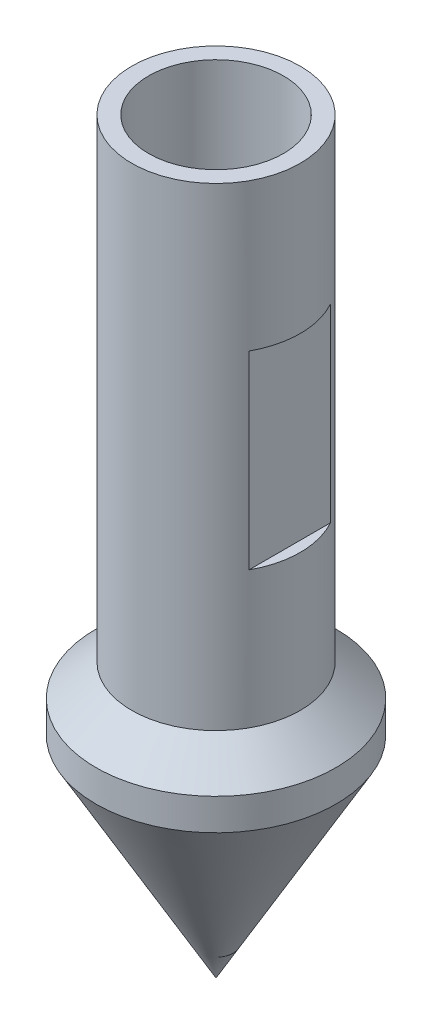
ISO-10303-21;
HEADER;
FILE_DESCRIPTION(('STEP AP214'),'2;1');
FILE_NAME('part.step','',(''),(''),'','','');
FILE_SCHEMA(('AUTOMOTIVE_DESIGN { 1 0 10303 214 1 1 1 1 }'));
ENDSEC;
DATA;
#1=APPLICATION_CONTEXT('core data for automotive mechanical design processes');
#2=APPLICATION_PROTOCOL_DEFINITION('international standard','automotive_design',2000,#1);
#3=PRODUCT_CONTEXT('',#1,'mechanical');
#4=PRODUCT('Part','Part','',(#3));
#5=PRODUCT_RELATED_PRODUCT_CATEGORY('part','',(#4));
#6=PRODUCT_DEFINITION_FORMATION('','',#4);
#7=PRODUCT_DEFINITION_CONTEXT('part definition',#1,'design');
#8=PRODUCT_DEFINITION('design','',#6,#7);
#9=PRODUCT_DEFINITION_SHAPE('','',#8);
#10=(LENGTH_UNIT() NAMED_UNIT(*) SI_UNIT(.MILLI.,.METRE.));
#11=(NAMED_UNIT(*) PLANE_ANGLE_UNIT() SI_UNIT($,.RADIAN.));
#12=(NAMED_UNIT(*) SI_UNIT($,.STERADIAN.) SOLID_ANGLE_UNIT());
#13=UNCERTAINTY_MEASURE_WITH_UNIT(LENGTH_MEASURE(1.E-05),#10,'distance_accuracy_value','');
#14=(GEOMETRIC_REPRESENTATION_CONTEXT(3) GLOBAL_UNCERTAINTY_ASSIGNED_CONTEXT((#13)) GLOBAL_UNIT_ASSIGNED_CONTEXT((#10,
#11,#12)) REPRESENTATION_CONTEXT('',''));
#15=CARTESIAN_POINT('',(0.,0.,0.));
#16=DIRECTION('',(0.,0.,1.));
#17=DIRECTION('',(1.,0.,0.));
#18=AXIS2_PLACEMENT_3D('',#15,#16,#17);
#19=CARTESIAN_POINT('',(0.,-7.60714285714286,0.));
#20=DIRECTION('',(0.,-1.,0.));
#21=DIRECTION('',(0.,0.,-1.));
#22=AXIS2_PLACEMENT_3D('',#19,#20,#21);
#23=CYLINDRICAL_SURFACE('',#22,4.);
#24=CARTESIAN_POINT('',(0.,8.5,0.));
#25=DIRECTION('',(0.,-1.,0.));
#26=DIRECTION('',(0.,0.,-1.));
#27=AXIS2_PLACEMENT_3D('',#24,#25,#26);
#28=CIRCLE('',#27,4.);
#29=CARTESIAN_POINT('',(3.5,8.5,-1.9364916731037));
#30=VERTEX_POINT('',#29);
#31=CARTESIAN_POINT('',(3.5,8.5,1.9364916731037));
#32=VERTEX_POINT('',#31);
#33=EDGE_CURVE('E104',#30,#32,#28,.T.);
#34=ORIENTED_EDGE('',*,*,#33,.F.);
#35=DIRECTION('',(0.,-1.,0.));
#36=VECTOR('',#35,1.);
#37=CARTESIAN_POINT('',(3.5,-7.60714285714286,-1.9364916731037));
#38=LINE('',#37,#36);
#39=CARTESIAN_POINT('',(3.5,-0.500000000000003,-1.9364916731037));
#40=VERTEX_POINT('',#39);
#41=EDGE_CURVE('E91',#40,#30,#38,.F.);
#42=ORIENTED_EDGE('',*,*,#41,.F.);
#43=CARTESIAN_POINT('',(0.,-0.500000000000003,0.));
#44=DIRECTION('',(0.,1.,0.));
#45=DIRECTION('',(-1.,0.,0.));
#46=AXIS2_PLACEMENT_3D('',#43,#44,#45);
#47=CIRCLE('',#46,4.);
#48=CARTESIAN_POINT('',(3.5,-0.500000000000003,1.9364916731037));
#49=VERTEX_POINT('',#48);
#50=EDGE_CURVE('E85',#49,#40,#47,.T.);
#51=ORIENTED_EDGE('',*,*,#50,.F.);
#52=DIRECTION('',(0.,-1.,0.));
#53=VECTOR('',#52,1.);
#54=CARTESIAN_POINT('',(3.5,-7.60714285714286,1.9364916731037));
#55=LINE('',#54,#53);
#56=EDGE_CURVE('E98',#32,#49,#55,.T.);
#57=ORIENTED_EDGE('',*,*,#56,.F.);
#58=EDGE_LOOP('',(#34,#42,#51,#57));
#59=FACE_BOUND('',#58,.T.);
#60=CARTESIAN_POINT('',(0.,-7.,0.));
#61=DIRECTION('',(0.,-1.,0.));
#62=DIRECTION('',(0.,0.,-1.));
#63=AXIS2_PLACEMENT_3D('',#60,#61,#62);
#64=CIRCLE('',#63,4.);
#65=CARTESIAN_POINT('',(0.,-7.,-4.));
#66=VERTEX_POINT('',#65);
#67=EDGE_CURVE('E165',#66,#66,#64,.T.);
#68=ORIENTED_EDGE('',*,*,#67,.F.);
#69=EDGE_LOOP('',(#68));
#70=FACE_BOUND('',#69,.T.);
#71=CARTESIAN_POINT('',(0.,15.5,0.));
#72=DIRECTION('',(0.,-1.,0.));
#73=DIRECTION('',(0.,0.,-1.));
#74=AXIS2_PLACEMENT_3D('',#71,#72,#73);
#75=CIRCLE('',#74,4.);
#76=CARTESIAN_POINT('',(0.,15.5,-4.));
#77=VERTEX_POINT('',#76);
#78=EDGE_CURVE('E92',#77,#77,#75,.T.);
#79=ORIENTED_EDGE('',*,*,#78,.T.);
#80=EDGE_LOOP('',(#79));
#81=FACE_BOUND('',#80,.T.);
#82=CARTESIAN_POINT('',(0.,-0.500000000000002,0.));
#83=DIRECTION('',(0.,1.,0.));
#84=DIRECTION('',(0.,0.,1.));
#85=AXIS2_PLACEMENT_3D('',#82,#83,#84);
#86=CIRCLE('',#85,4.);
#87=CARTESIAN_POINT('',(-3.5,-0.500000000000002,-1.93649167310371));
#88=VERTEX_POINT('',#87);
#89=CARTESIAN_POINT('',(-3.5,-0.500000000000002,1.93649167310371));
#90=VERTEX_POINT('',#89);
#91=EDGE_CURVE('E11',#88,#90,#86,.T.);
#92=ORIENTED_EDGE('',*,*,#91,.F.);
#93=DIRECTION('',(0.,-1.,0.));
#94=VECTOR('',#93,1.);
#95=CARTESIAN_POINT('',(-3.5,-7.60714285714286,-1.93649167310371));
#96=LINE('',#95,#94);
#97=CARTESIAN_POINT('',(-3.5,8.5,-1.9364916731037));
#98=VERTEX_POINT('',#97);
#99=EDGE_CURVE('E52',#98,#88,#96,.T.);
#100=ORIENTED_EDGE('',*,*,#99,.F.);
#101=CARTESIAN_POINT('',(0.,8.5,0.));
#102=DIRECTION('',(0.,-1.,0.));
#103=DIRECTION('',(0.,0.,-1.));
#104=AXIS2_PLACEMENT_3D('',#101,#102,#103);
#105=CIRCLE('',#104,4.);
#106=CARTESIAN_POINT('',(-3.5,8.5,1.9364916731037));
#107=VERTEX_POINT('',#106);
#108=EDGE_CURVE('E113',#107,#98,#105,.T.);
#109=ORIENTED_EDGE('',*,*,#108,.F.);
#110=DIRECTION('',(0.,-1.,0.));
#111=VECTOR('',#110,1.);
#112=CARTESIAN_POINT('',(-3.5,-7.60714285714286,1.93649167310371));
#113=LINE('',#112,#111);
#114=EDGE_CURVE('E116',#90,#107,#113,.F.);
#115=ORIENTED_EDGE('',*,*,#114,.F.);
#116=EDGE_LOOP('',(#92,#100,#109,#115));
#117=FACE_BOUND('',#116,.T.);
#118=ADVANCED_FACE('F43',(#59,#70,#81,#117),#23,.T.);
#119=CARTESIAN_POINT('',(0.,-10.,0.));
#120=DIRECTION('',(0.,1.,0.));
#121=DIRECTION('',(0.,0.,1.));
#122=AXIS2_PLACEMENT_3D('',#119,#120,#121);
#123=CONICAL_SURFACE('',#122,5.7,0.518068528456721);
#124=CARTESIAN_POINT('',(0.,-20.,0.));
#125=VERTEX_POINT('',#124);
#126=VERTEX_LOOP('',#125);
#127=FACE_BOUND('',#126,.T.);
#128=CARTESIAN_POINT('',(0.,-10.,0.));
#129=DIRECTION('',(0.,-1.,0.));
#130=DIRECTION('',(0.,0.,-1.));
#131=AXIS2_PLACEMENT_3D('',#128,#129,#130);
#132=CIRCLE('',#131,5.7);
#133=CARTESIAN_POINT('',(0.,-10.,-5.7));
#134=VERTEX_POINT('',#133);
#135=EDGE_CURVE('E174',#134,#134,#132,.T.);
#136=ORIENTED_EDGE('',*,*,#135,.T.);
#137=EDGE_LOOP('',(#136));
#138=FACE_BOUND('',#137,.T.);
#139=ADVANCED_FACE('F45',(#127,#138),#123,.T.);
#140=CARTESIAN_POINT('',(0.,15.5,0.));
#141=DIRECTION('',(0.,-1.,0.));
#142=DIRECTION('',(0.,0.,-1.));
#143=AXIS2_PLACEMENT_3D('',#140,#141,#142);
#144=PLANE('',#143);
#145=CARTESIAN_POINT('',(0.,15.5,0.));
#146=DIRECTION('',(0.,1.,0.));
#147=DIRECTION('',(0.,0.,1.));
#148=AXIS2_PLACEMENT_3D('',#145,#146,#147);
#149=CIRCLE('',#148,3.2);
#150=CARTESIAN_POINT('',(0.,15.5,3.2));
#151=VERTEX_POINT('',#150);
#152=EDGE_CURVE('E132',#151,#151,#149,.T.);
#153=ORIENTED_EDGE('',*,*,#152,.F.);
#154=EDGE_LOOP('',(#153));
#155=FACE_BOUND('',#154,.T.);
#156=ORIENTED_EDGE('',*,*,#78,.F.);
#157=EDGE_LOOP('',(#156));
#158=FACE_BOUND('',#157,.T.);
#159=ADVANCED_FACE('F146',(#155,#158),#144,.F.);
#160=CARTESIAN_POINT('',(0.,-7.,0.));
#161=DIRECTION('',(0.,-1.,0.));
#162=DIRECTION('',(0.,0.,-1.));
#163=AXIS2_PLACEMENT_3D('',#160,#161,#162);
#164=CONICAL_SURFACE('',#163,4.,0.847816973393407);
#165=CARTESIAN_POINT('',(0.,-8.5,0.));
#166=DIRECTION('',(0.,-1.,0.));
#167=DIRECTION('',(0.,0.,-1.));
#168=AXIS2_PLACEMENT_3D('',#165,#166,#167);
#169=CIRCLE('',#168,5.7);
#170=CARTESIAN_POINT('',(0.,-8.5,-5.7));
#171=VERTEX_POINT('',#170);
#172=EDGE_CURVE('E168',#171,#171,#169,.T.);
#173=ORIENTED_EDGE('',*,*,#172,.F.);
#174=EDGE_LOOP('',(#173));
#175=FACE_BOUND('',#174,.T.);
#176=ORIENTED_EDGE('',*,*,#67,.T.);
#177=EDGE_LOOP('',(#176));
#178=FACE_BOUND('',#177,.T.);
#179=ADVANCED_FACE('F149',(#175,#178),#164,.T.);
#180=CARTESIAN_POINT('',(0.,-7.60714285714286,0.));
#181=DIRECTION('',(0.,-1.,0.));
#182=DIRECTION('',(0.,0.,-1.));
#183=AXIS2_PLACEMENT_3D('',#180,#181,#182);
#184=CYLINDRICAL_SURFACE('',#183,5.7);
#185=ORIENTED_EDGE('',*,*,#135,.F.);
#186=EDGE_LOOP('',(#185));
#187=FACE_BOUND('',#186,.T.);
#188=ORIENTED_EDGE('',*,*,#172,.T.);
#189=EDGE_LOOP('',(#188));
#190=FACE_BOUND('',#189,.T.);
#191=ADVANCED_FACE('F156',(#187,#190),#184,.T.);
#192=CARTESIAN_POINT('',(0.,6.,0.));
#193=DIRECTION('',(0.,1.,0.));
#194=DIRECTION('',(0.,0.,1.));
#195=AXIS2_PLACEMENT_3D('',#192,#193,#194);
#196=CYLINDRICAL_SURFACE('',#195,3.2);
#197=CARTESIAN_POINT('',(0.,6.,0.));
#198=DIRECTION('',(0.,1.,0.));
#199=DIRECTION('',(0.,0.,1.));
#200=AXIS2_PLACEMENT_3D('',#197,#198,#199);
#201=CIRCLE('',#200,3.2);
#202=CARTESIAN_POINT('',(0.,6.,3.2));
#203=VERTEX_POINT('',#202);
#204=EDGE_CURVE('E178',#203,#203,#201,.T.);
#205=ORIENTED_EDGE('',*,*,#204,.F.);
#206=EDGE_LOOP('',(#205));
#207=FACE_BOUND('',#206,.T.);
#208=ORIENTED_EDGE('',*,*,#152,.T.);
#209=EDGE_LOOP('',(#208));
#210=FACE_BOUND('',#209,.T.);
#211=ADVANCED_FACE('F197',(#207,#210),#196,.F.);
#212=CARTESIAN_POINT('',(0.,6.,0.));
#213=DIRECTION('',(0.,1.,0.));
#214=DIRECTION('',(0.,0.,1.));
#215=AXIS2_PLACEMENT_3D('',#212,#213,#214);
#216=PLANE('',#215);
#217=ORIENTED_EDGE('',*,*,#204,.T.);
#218=EDGE_LOOP('',(#217));
#219=FACE_BOUND('',#218,.T.);
#220=ADVANCED_FACE('F190',(#219),#216,.T.);
#221=CARTESIAN_POINT('',(7.5,8.5,9.5));
#222=DIRECTION('',(0.,-1.,0.));
#223=DIRECTION('',(0.,0.,-1.));
#224=AXIS2_PLACEMENT_3D('',#221,#222,#223);
#225=PLANE('',#224);
#226=ORIENTED_EDGE('',*,*,#33,.T.);
#227=DIRECTION('',(0.,0.,-1.));
#228=VECTOR('',#227,1.);
#229=CARTESIAN_POINT('',(3.5,8.5,9.5));
#230=LINE('',#229,#228);
#231=EDGE_CURVE('E100',#32,#30,#230,.T.);
#232=ORIENTED_EDGE('',*,*,#231,.T.);
#233=EDGE_LOOP('',(#226,#232));
#234=FACE_BOUND('',#233,.T.);
#235=ADVANCED_FACE('F188',(#234),#225,.T.);
#236=CARTESIAN_POINT('',(3.5,8.5,9.5));
#237=DIRECTION('',(1.,0.,0.));
#238=DIRECTION('',(0.,1.,0.));
#239=AXIS2_PLACEMENT_3D('',#236,#237,#238);
#240=PLANE('',#239);
#241=ORIENTED_EDGE('',*,*,#56,.T.);
#242=DIRECTION('',(0.,0.,-1.));
#243=VECTOR('',#242,1.);
#244=CARTESIAN_POINT('',(3.5,-0.500000000000003,9.5));
#245=LINE('',#244,#243);
#246=EDGE_CURVE('E65',#49,#40,#245,.T.);
#247=ORIENTED_EDGE('',*,*,#246,.T.);
#248=ORIENTED_EDGE('',*,*,#41,.T.);
#249=ORIENTED_EDGE('',*,*,#231,.F.);
#250=EDGE_LOOP('',(#241,#247,#248,#249));
#251=FACE_BOUND('',#250,.T.);
#252=ADVANCED_FACE('F95',(#251),#240,.T.);
#253=CARTESIAN_POINT('',(7.5,-0.500000000000002,9.5));
#254=DIRECTION('',(0.,1.,0.));
#255=DIRECTION('',(-1.,0.,0.));
#256=AXIS2_PLACEMENT_3D('',#253,#254,#255);
#257=PLANE('',#256);
#258=ORIENTED_EDGE('',*,*,#50,.T.);
#259=ORIENTED_EDGE('',*,*,#246,.F.);
#260=EDGE_LOOP('',(#258,#259));
#261=FACE_BOUND('',#260,.T.);
#262=ADVANCED_FACE('F86',(#261),#257,.T.);
#263=CARTESIAN_POINT('',(-7.5,-0.500000000000002,9.5));
#264=DIRECTION('',(0.,1.,0.));
#265=DIRECTION('',(0.,0.,1.));
#266=AXIS2_PLACEMENT_3D('',#263,#264,#265);
#267=PLANE('',#266);
#268=ORIENTED_EDGE('',*,*,#91,.T.);
#269=DIRECTION('',(0.,0.,-1.));
#270=VECTOR('',#269,1.);
#271=CARTESIAN_POINT('',(-3.5,-0.500000000000002,9.5));
#272=LINE('',#271,#270);
#273=EDGE_CURVE('E124',#90,#88,#272,.T.);
#274=ORIENTED_EDGE('',*,*,#273,.T.);
#275=EDGE_LOOP('',(#268,#274));
#276=FACE_BOUND('',#275,.T.);
#277=ADVANCED_FACE('F130',(#276),#267,.T.);
#278=CARTESIAN_POINT('',(-3.5,8.5,9.5));
#279=DIRECTION('',(-1.,0.,0.));
#280=DIRECTION('',(0.,-1.,0.));
#281=AXIS2_PLACEMENT_3D('',#278,#279,#280);
#282=PLANE('',#281);
#283=ORIENTED_EDGE('',*,*,#99,.T.);
#284=ORIENTED_EDGE('',*,*,#273,.F.);
#285=ORIENTED_EDGE('',*,*,#114,.T.);
#286=DIRECTION('',(0.,0.,-1.));
#287=VECTOR('',#286,1.);
#288=CARTESIAN_POINT('',(-3.5,8.5,9.5));
#289=LINE('',#288,#287);
#290=EDGE_CURVE('E58',#107,#98,#289,.T.);
#291=ORIENTED_EDGE('',*,*,#290,.T.);
#292=EDGE_LOOP('',(#283,#284,#285,#291));
#293=FACE_BOUND('',#292,.T.);
#294=ADVANCED_FACE('F123',(#293),#282,.T.);
#295=CARTESIAN_POINT('',(-7.5,8.5,9.5));
#296=DIRECTION('',(0.,-1.,0.));
#297=DIRECTION('',(0.,0.,-1.));
#298=AXIS2_PLACEMENT_3D('',#295,#296,#297);
#299=PLANE('',#298);
#300=ORIENTED_EDGE('',*,*,#108,.T.);
#301=ORIENTED_EDGE('',*,*,#290,.F.);
#302=EDGE_LOOP('',(#300,#301));
#303=FACE_BOUND('',#302,.T.);
#304=ADVANCED_FACE('F134',(#303),#299,.T.);
#305=CLOSED_SHELL('',(#118,#139,#159,#179,#191,#211,#220,#235,#252,#262,#277,#294,#304));
#306=MANIFOLD_SOLID_BREP('B2',#305);
#307=ADVANCED_BREP_SHAPE_REPRESENTATION('',(#18,#306),#14);
#308=SHAPE_DEFINITION_REPRESENTATION(#9,#307);
ENDSEC;
END-ISO-10303-21;
